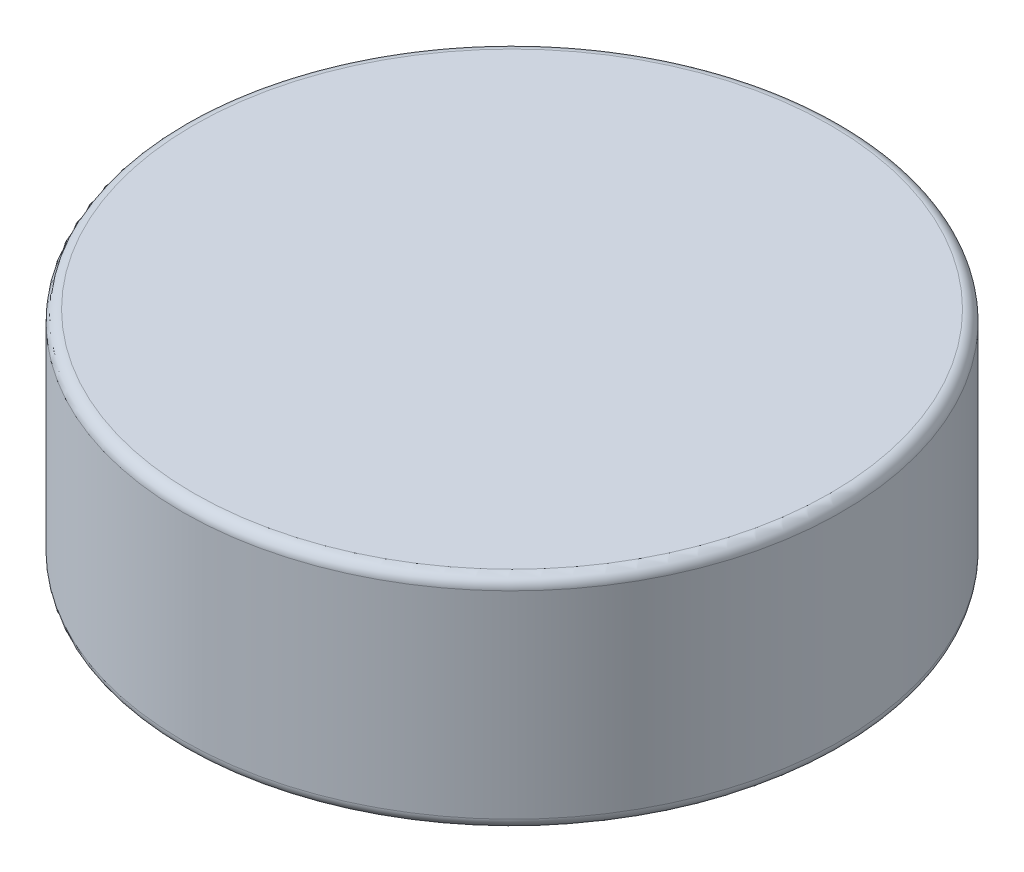
ISO-10303-21;
HEADER;
FILE_DESCRIPTION(('STEP AP214'),'2;1');
FILE_NAME('part.step','',(''),(''),'','','');
FILE_SCHEMA(('AUTOMOTIVE_DESIGN { 1 0 10303 214 1 1 1 1 }'));
ENDSEC;
DATA;
#1=APPLICATION_CONTEXT('core data for automotive mechanical design processes');
#2=APPLICATION_PROTOCOL_DEFINITION('international standard','automotive_design',2000,#1);
#3=PRODUCT_CONTEXT('',#1,'mechanical');
#4=PRODUCT('Part','Part','',(#3));
#5=PRODUCT_RELATED_PRODUCT_CATEGORY('part','',(#4));
#6=PRODUCT_DEFINITION_FORMATION('','',#4);
#7=PRODUCT_DEFINITION_CONTEXT('part definition',#1,'design');
#8=PRODUCT_DEFINITION('design','',#6,#7);
#9=PRODUCT_DEFINITION_SHAPE('','',#8);
#10=(LENGTH_UNIT() NAMED_UNIT(*) SI_UNIT(.MILLI.,.METRE.));
#11=(NAMED_UNIT(*) PLANE_ANGLE_UNIT() SI_UNIT($,.RADIAN.));
#12=(NAMED_UNIT(*) SI_UNIT($,.STERADIAN.) SOLID_ANGLE_UNIT());
#13=UNCERTAINTY_MEASURE_WITH_UNIT(LENGTH_MEASURE(1.E-05),#10,'distance_accuracy_value','');
#14=(GEOMETRIC_REPRESENTATION_CONTEXT(3) GLOBAL_UNCERTAINTY_ASSIGNED_CONTEXT((#13)) GLOBAL_UNIT_ASSIGNED_CONTEXT((#10,
#11,#12)) REPRESENTATION_CONTEXT('',''));
#15=CARTESIAN_POINT('',(0.,0.,0.));
#16=DIRECTION('',(0.,0.,1.));
#17=DIRECTION('',(1.,0.,0.));
#18=AXIS2_PLACEMENT_3D('',#15,#16,#17);
#19=CARTESIAN_POINT('',(0.,2.,0.));
#20=DIRECTION('',(0.,-1.,0.));
#21=DIRECTION('',(0.,0.,-1.));
#22=AXIS2_PLACEMENT_3D('',#19,#20,#21);
#23=CYLINDRICAL_SURFACE('',#22,3.);
#24=CARTESIAN_POINT('',(0.,0.1,0.));
#25=DIRECTION('',(0.,1.,0.));
#26=DIRECTION('',(0.,0.,1.));
#27=AXIS2_PLACEMENT_3D('',#24,#25,#26);
#28=CIRCLE('',#27,3.);
#29=CARTESIAN_POINT('',(0.,0.1,3.));
#30=VERTEX_POINT('',#29);
#31=EDGE_CURVE('E43',#30,#30,#28,.T.);
#32=ORIENTED_EDGE('',*,*,#31,.T.);
#33=EDGE_LOOP('',(#32));
#34=FACE_BOUND('',#33,.T.);
#35=CARTESIAN_POINT('',(0.,1.9,0.));
#36=DIRECTION('',(0.,1.,0.));
#37=DIRECTION('',(0.,0.,1.));
#38=AXIS2_PLACEMENT_3D('',#35,#36,#37);
#39=CIRCLE('',#38,3.);
#40=CARTESIAN_POINT('',(0.,1.9,3.));
#41=VERTEX_POINT('',#40);
#42=EDGE_CURVE('E47',#41,#41,#39,.F.);
#43=ORIENTED_EDGE('',*,*,#42,.T.);
#44=EDGE_LOOP('',(#43));
#45=FACE_BOUND('',#44,.T.);
#46=ADVANCED_FACE('F32',(#34,#45),#23,.T.);
#47=CARTESIAN_POINT('',(0.,2.,0.));
#48=DIRECTION('',(0.,1.,0.));
#49=DIRECTION('',(0.,0.,1.));
#50=AXIS2_PLACEMENT_3D('',#47,#48,#49);
#51=PLANE('',#50);
#52=CARTESIAN_POINT('',(0.,2.,0.));
#53=DIRECTION('',(0.,1.,0.));
#54=DIRECTION('',(0.,0.,1.));
#55=AXIS2_PLACEMENT_3D('',#52,#53,#54);
#56=CIRCLE('',#55,2.9);
#57=CARTESIAN_POINT('',(0.,2.,2.9));
#58=VERTEX_POINT('',#57);
#59=EDGE_CURVE('E10',#58,#58,#56,.T.);
#60=ORIENTED_EDGE('',*,*,#59,.T.);
#61=EDGE_LOOP('',(#60));
#62=FACE_BOUND('',#61,.T.);
#63=ADVANCED_FACE('F63',(#62),#51,.T.);
#64=CARTESIAN_POINT('',(0.,0.,0.));
#65=DIRECTION('',(0.,1.,0.));
#66=DIRECTION('',(0.,0.,1.));
#67=AXIS2_PLACEMENT_3D('',#64,#65,#66);
#68=PLANE('',#67);
#69=CARTESIAN_POINT('',(0.,0.,0.));
#70=DIRECTION('',(0.,1.,0.));
#71=DIRECTION('',(0.,0.,1.));
#72=AXIS2_PLACEMENT_3D('',#69,#70,#71);
#73=CIRCLE('',#72,2.9);
#74=CARTESIAN_POINT('',(0.,0.,2.9));
#75=VERTEX_POINT('',#74);
#76=EDGE_CURVE('E39',#75,#75,#73,.F.);
#77=ORIENTED_EDGE('',*,*,#76,.T.);
#78=EDGE_LOOP('',(#77));
#79=FACE_BOUND('',#78,.T.);
#80=ADVANCED_FACE('F60',(#79),#68,.F.);
#81=CARTESIAN_POINT('',(0.,0.1,0.));
#82=DIRECTION('',(0.,1.,0.));
#83=DIRECTION('',(0.,0.,1.));
#84=AXIS2_PLACEMENT_3D('',#81,#82,#83);
#85=TOROIDAL_SURFACE('',#84,2.9,0.1);
#86=ORIENTED_EDGE('',*,*,#76,.F.);
#87=EDGE_LOOP('',(#86));
#88=FACE_BOUND('',#87,.T.);
#89=ORIENTED_EDGE('',*,*,#31,.F.);
#90=EDGE_LOOP('',(#89));
#91=FACE_BOUND('',#90,.T.);
#92=ADVANCED_FACE('F56',(#88,#91),#85,.T.);
#93=CARTESIAN_POINT('',(0.,1.9,0.));
#94=DIRECTION('',(0.,1.,0.));
#95=DIRECTION('',(0.,0.,1.));
#96=AXIS2_PLACEMENT_3D('',#93,#94,#95);
#97=TOROIDAL_SURFACE('',#96,2.9,0.1);
#98=ORIENTED_EDGE('',*,*,#42,.F.);
#99=EDGE_LOOP('',(#98));
#100=FACE_BOUND('',#99,.T.);
#101=ORIENTED_EDGE('',*,*,#59,.F.);
#102=EDGE_LOOP('',(#101));
#103=FACE_BOUND('',#102,.T.);
#104=ADVANCED_FACE('F34',(#100,#103),#97,.T.);
#105=CLOSED_SHELL('',(#46,#63,#80,#92,#104));
#106=MANIFOLD_SOLID_BREP('B2',#105);
#107=ADVANCED_BREP_SHAPE_REPRESENTATION('',(#18,#106),#14);
#108=SHAPE_DEFINITION_REPRESENTATION(#9,#107);
ENDSEC;
END-ISO-10303-21;
